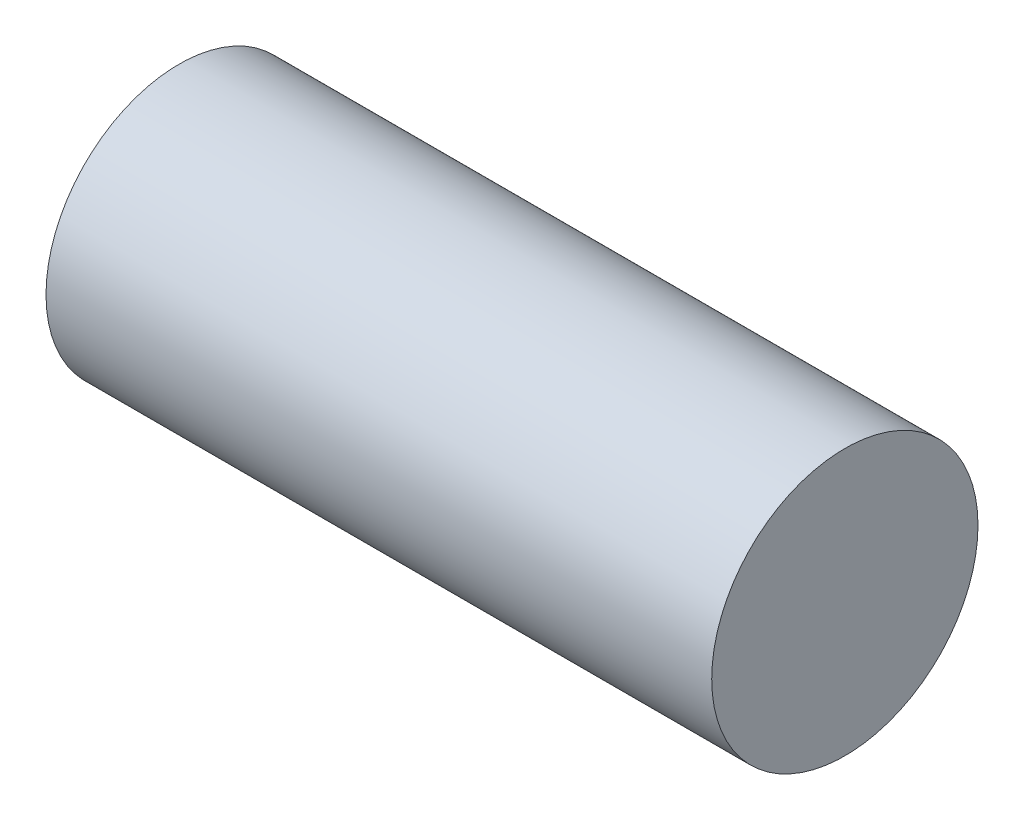
ISO-10303-21;
HEADER;
FILE_DESCRIPTION(('STEP AP214'),'2;1');
FILE_NAME('part.step','',(''),(''),'','','');
FILE_SCHEMA(('AUTOMOTIVE_DESIGN { 1 0 10303 214 1 1 1 1 }'));
ENDSEC;
DATA;
#1=APPLICATION_CONTEXT('core data for automotive mechanical design processes');
#2=APPLICATION_PROTOCOL_DEFINITION('international standard','automotive_design',2000,#1);
#3=PRODUCT_CONTEXT('',#1,'mechanical');
#4=PRODUCT('Part','Part','',(#3));
#5=PRODUCT_RELATED_PRODUCT_CATEGORY('part','',(#4));
#6=PRODUCT_DEFINITION_FORMATION('','',#4);
#7=PRODUCT_DEFINITION_CONTEXT('part definition',#1,'design');
#8=PRODUCT_DEFINITION('design','',#6,#7);
#9=PRODUCT_DEFINITION_SHAPE('','',#8);
#10=(LENGTH_UNIT() NAMED_UNIT(*) SI_UNIT(.MILLI.,.METRE.));
#11=(NAMED_UNIT(*) PLANE_ANGLE_UNIT() SI_UNIT($,.RADIAN.));
#12=(NAMED_UNIT(*) SI_UNIT($,.STERADIAN.) SOLID_ANGLE_UNIT());
#13=UNCERTAINTY_MEASURE_WITH_UNIT(LENGTH_MEASURE(1.E-05),#10,'distance_accuracy_value','');
#14=(GEOMETRIC_REPRESENTATION_CONTEXT(3) GLOBAL_UNCERTAINTY_ASSIGNED_CONTEXT((#13)) GLOBAL_UNIT_ASSIGNED_CONTEXT((#10,
#11,#12)) REPRESENTATION_CONTEXT('',''));
#15=CARTESIAN_POINT('',(0.,0.,0.));
#16=DIRECTION('',(0.,0.,1.));
#17=DIRECTION('',(1.,0.,0.));
#18=AXIS2_PLACEMENT_3D('',#15,#16,#17);
#19=CARTESIAN_POINT('',(12.5,0.,0.));
#20=DIRECTION('',(-1.,0.,0.));
#21=DIRECTION('',(0.,0.,1.));
#22=AXIS2_PLACEMENT_3D('',#19,#20,#21);
#23=CYLINDRICAL_SURFACE('',#22,2.5);
#24=CARTESIAN_POINT('',(12.5,0.,0.));
#25=DIRECTION('',(1.,0.,0.));
#26=DIRECTION('',(0.,0.,-1.));
#27=AXIS2_PLACEMENT_3D('',#24,#25,#26);
#28=CIRCLE('',#27,2.5);
#29=CARTESIAN_POINT('',(12.5,0.,-2.5));
#30=VERTEX_POINT('',#29);
#31=EDGE_CURVE('E10',#30,#30,#28,.T.);
#32=ORIENTED_EDGE('',*,*,#31,.F.);
#33=EDGE_LOOP('',(#32));
#34=FACE_BOUND('',#33,.T.);
#35=CARTESIAN_POINT('',(0.,0.,0.));
#36=DIRECTION('',(1.,0.,0.));
#37=DIRECTION('',(0.,0.,-1.));
#38=AXIS2_PLACEMENT_3D('',#35,#36,#37);
#39=CIRCLE('',#38,2.5);
#40=CARTESIAN_POINT('',(0.,0.,-2.5));
#41=VERTEX_POINT('',#40);
#42=EDGE_CURVE('E46',#41,#41,#39,.T.);
#43=ORIENTED_EDGE('',*,*,#42,.T.);
#44=EDGE_LOOP('',(#43));
#45=FACE_BOUND('',#44,.T.);
#46=ADVANCED_FACE('F43',(#34,#45),#23,.T.);
#47=CARTESIAN_POINT('',(12.5,0.,0.));
#48=DIRECTION('',(1.,0.,0.));
#49=DIRECTION('',(0.,0.,-1.));
#50=AXIS2_PLACEMENT_3D('',#47,#48,#49);
#51=PLANE('',#50);
#52=ORIENTED_EDGE('',*,*,#31,.T.);
#53=EDGE_LOOP('',(#52));
#54=FACE_BOUND('',#53,.T.);
#55=ADVANCED_FACE('F60',(#54),#51,.T.);
#56=CARTESIAN_POINT('',(0.,0.,0.));
#57=DIRECTION('',(1.,0.,0.));
#58=DIRECTION('',(0.,0.,-1.));
#59=AXIS2_PLACEMENT_3D('',#56,#57,#58);
#60=PLANE('',#59);
#61=ORIENTED_EDGE('',*,*,#42,.F.);
#62=EDGE_LOOP('',(#61));
#63=FACE_BOUND('',#62,.T.);
#64=ADVANCED_FACE('F58',(#63),#60,.F.);
#65=CLOSED_SHELL('',(#46,#55,#64));
#66=MANIFOLD_SOLID_BREP('B2',#65);
#67=ADVANCED_BREP_SHAPE_REPRESENTATION('',(#18,#66),#14);
#68=SHAPE_DEFINITION_REPRESENTATION(#9,#67);
ENDSEC;
END-ISO-10303-21;
